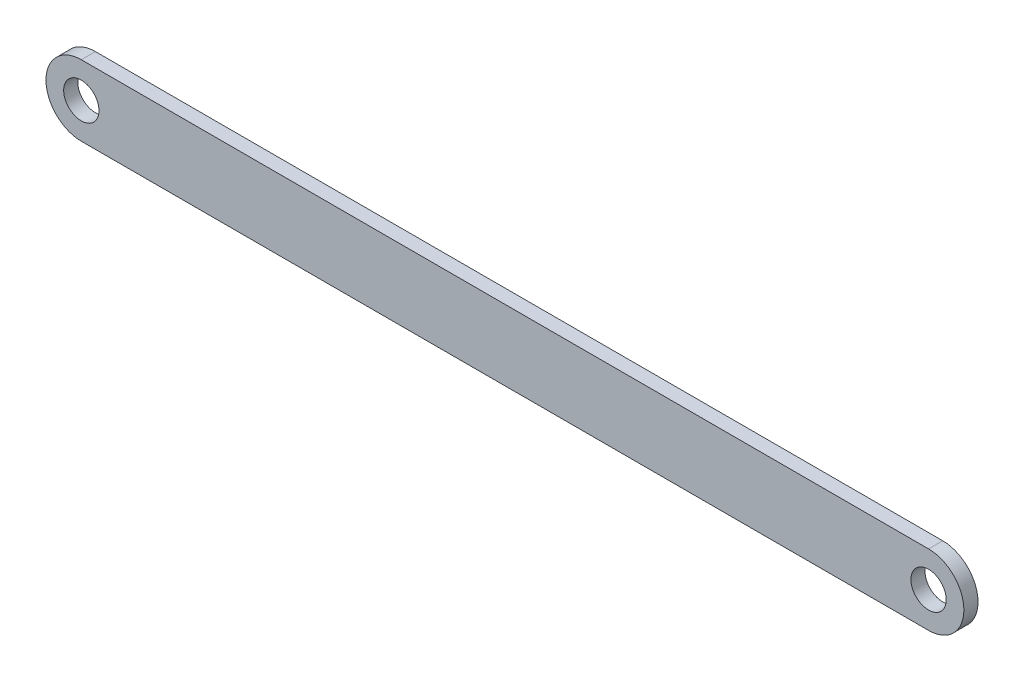
ISO-10303-21;
HEADER;
FILE_DESCRIPTION(('STEP AP214'),'2;1');
FILE_NAME('part.step','',(''),(''),'','','');
FILE_SCHEMA(('AUTOMOTIVE_DESIGN { 1 0 10303 214 1 1 1 1 }'));
ENDSEC;
DATA;
#1=APPLICATION_CONTEXT('core data for automotive mechanical design processes');
#2=APPLICATION_PROTOCOL_DEFINITION('international standard','automotive_design',2000,#1);
#3=PRODUCT_CONTEXT('',#1,'mechanical');
#4=PRODUCT('Part','Part','',(#3));
#5=PRODUCT_RELATED_PRODUCT_CATEGORY('part','',(#4));
#6=PRODUCT_DEFINITION_FORMATION('','',#4);
#7=PRODUCT_DEFINITION_CONTEXT('part definition',#1,'design');
#8=PRODUCT_DEFINITION('design','',#6,#7);
#9=PRODUCT_DEFINITION_SHAPE('','',#8);
#10=(LENGTH_UNIT() NAMED_UNIT(*) SI_UNIT(.MILLI.,.METRE.));
#11=(NAMED_UNIT(*) PLANE_ANGLE_UNIT() SI_UNIT($,.RADIAN.));
#12=(NAMED_UNIT(*) SI_UNIT($,.STERADIAN.) SOLID_ANGLE_UNIT());
#13=UNCERTAINTY_MEASURE_WITH_UNIT(LENGTH_MEASURE(1.E-05),#10,'distance_accuracy_value','');
#14=(GEOMETRIC_REPRESENTATION_CONTEXT(3) GLOBAL_UNCERTAINTY_ASSIGNED_CONTEXT((#13)) GLOBAL_UNIT_ASSIGNED_CONTEXT((#10,
#11,#12)) REPRESENTATION_CONTEXT('',''));
#15=CARTESIAN_POINT('',(0.,0.,0.));
#16=DIRECTION('',(0.,0.,1.));
#17=DIRECTION('',(1.,0.,0.));
#18=AXIS2_PLACEMENT_3D('',#15,#16,#17);
#19=CARTESIAN_POINT('',(76.2,0.,2.54));
#20=DIRECTION('',(0.,0.,-1.));
#21=DIRECTION('',(-1.,0.,0.));
#22=AXIS2_PLACEMENT_3D('',#19,#20,#21);
#23=PLANE('',#22);
#24=CARTESIAN_POINT('',(76.2,0.,2.54));
#25=DIRECTION('',(0.,0.,1.));
#26=DIRECTION('',(-1.,0.,0.));
#27=AXIS2_PLACEMENT_3D('',#24,#25,#26);
#28=CIRCLE('',#27,6.35);
#29=CARTESIAN_POINT('',(76.2,-6.35,2.54));
#30=VERTEX_POINT('',#29);
#31=CARTESIAN_POINT('',(76.2,6.35,2.54));
#32=VERTEX_POINT('',#31);
#33=EDGE_CURVE('E96',#30,#32,#28,.T.);
#34=ORIENTED_EDGE('',*,*,#33,.T.);
#35=DIRECTION('',(-1.,0.,0.));
#36=VECTOR('',#35,1.);
#37=CARTESIAN_POINT('',(-76.2,6.35,2.54));
#38=LINE('',#37,#36);
#39=CARTESIAN_POINT('',(-76.2,6.35,2.54));
#40=VERTEX_POINT('',#39);
#41=EDGE_CURVE('E91',#32,#40,#38,.T.);
#42=ORIENTED_EDGE('',*,*,#41,.T.);
#43=CARTESIAN_POINT('',(-76.2,0.,2.54));
#44=DIRECTION('',(0.,0.,1.));
#45=DIRECTION('',(1.,0.,0.));
#46=AXIS2_PLACEMENT_3D('',#43,#44,#45);
#47=CIRCLE('',#46,6.35);
#48=CARTESIAN_POINT('',(-76.2,-6.35,2.54));
#49=VERTEX_POINT('',#48);
#50=EDGE_CURVE('E94',#40,#49,#47,.T.);
#51=ORIENTED_EDGE('',*,*,#50,.T.);
#52=DIRECTION('',(1.,0.,0.));
#53=VECTOR('',#52,1.);
#54=CARTESIAN_POINT('',(-76.2,-6.35,2.54));
#55=LINE('',#54,#53);
#56=EDGE_CURVE('E61',#49,#30,#55,.T.);
#57=ORIENTED_EDGE('',*,*,#56,.T.);
#58=EDGE_LOOP('',(#34,#42,#51,#57));
#59=FACE_BOUND('',#58,.T.);
#60=CARTESIAN_POINT('',(-76.2,0.,2.54));
#61=DIRECTION('',(0.,0.,1.));
#62=DIRECTION('',(1.,0.,0.));
#63=AXIS2_PLACEMENT_3D('',#60,#61,#62);
#64=CIRCLE('',#63,3.175);
#65=CARTESIAN_POINT('',(-73.025,0.,2.54));
#66=VERTEX_POINT('',#65);
#67=EDGE_CURVE('E116',#66,#66,#64,.T.);
#68=ORIENTED_EDGE('',*,*,#67,.F.);
#69=EDGE_LOOP('',(#68));
#70=FACE_BOUND('',#69,.T.);
#71=CARTESIAN_POINT('',(76.2,0.,2.54));
#72=DIRECTION('',(0.,0.,1.));
#73=DIRECTION('',(-1.,0.,0.));
#74=AXIS2_PLACEMENT_3D('',#71,#72,#73);
#75=CIRCLE('',#74,3.175);
#76=CARTESIAN_POINT('',(73.025,0.,2.54));
#77=VERTEX_POINT('',#76);
#78=EDGE_CURVE('E138',#77,#77,#75,.T.);
#79=ORIENTED_EDGE('',*,*,#78,.F.);
#80=EDGE_LOOP('',(#79));
#81=FACE_BOUND('',#80,.T.);
#82=ADVANCED_FACE('F43',(#59,#70,#81),#23,.F.);
#83=CARTESIAN_POINT('',(76.2,0.,0.));
#84=DIRECTION('',(0.,0.,-1.));
#85=DIRECTION('',(-1.,0.,0.));
#86=AXIS2_PLACEMENT_3D('',#83,#84,#85);
#87=PLANE('',#86);
#88=CARTESIAN_POINT('',(-76.2,0.,0.));
#89=DIRECTION('',(0.,0.,1.));
#90=DIRECTION('',(1.,0.,0.));
#91=AXIS2_PLACEMENT_3D('',#88,#89,#90);
#92=CIRCLE('',#91,3.175);
#93=CARTESIAN_POINT('',(-73.025,0.,0.));
#94=VERTEX_POINT('',#93);
#95=EDGE_CURVE('E134',#94,#94,#92,.T.);
#96=ORIENTED_EDGE('',*,*,#95,.T.);
#97=EDGE_LOOP('',(#96));
#98=FACE_BOUND('',#97,.T.);
#99=CARTESIAN_POINT('',(76.2,0.,0.));
#100=DIRECTION('',(0.,0.,1.));
#101=DIRECTION('',(-1.,0.,0.));
#102=AXIS2_PLACEMENT_3D('',#99,#100,#101);
#103=CIRCLE('',#102,6.35);
#104=CARTESIAN_POINT('',(76.2,-6.35,0.));
#105=VERTEX_POINT('',#104);
#106=CARTESIAN_POINT('',(76.2,6.35,0.));
#107=VERTEX_POINT('',#106);
#108=EDGE_CURVE('E112',#105,#107,#103,.T.);
#109=ORIENTED_EDGE('',*,*,#108,.F.);
#110=DIRECTION('',(1.,0.,0.));
#111=VECTOR('',#110,1.);
#112=CARTESIAN_POINT('',(-76.2,-6.35,0.));
#113=LINE('',#112,#111);
#114=CARTESIAN_POINT('',(-76.2,-6.35,0.));
#115=VERTEX_POINT('',#114);
#116=EDGE_CURVE('E84',#115,#105,#113,.T.);
#117=ORIENTED_EDGE('',*,*,#116,.F.);
#118=CARTESIAN_POINT('',(-76.2,0.,0.));
#119=DIRECTION('',(0.,0.,1.));
#120=DIRECTION('',(1.,0.,0.));
#121=AXIS2_PLACEMENT_3D('',#118,#119,#120);
#122=CIRCLE('',#121,6.35);
#123=CARTESIAN_POINT('',(-76.2,6.35,0.));
#124=VERTEX_POINT('',#123);
#125=EDGE_CURVE('E78',#124,#115,#122,.T.);
#126=ORIENTED_EDGE('',*,*,#125,.F.);
#127=DIRECTION('',(-1.,0.,0.));
#128=VECTOR('',#127,1.);
#129=CARTESIAN_POINT('',(-76.2,6.35,0.));
#130=LINE('',#129,#128);
#131=EDGE_CURVE('E101',#107,#124,#130,.T.);
#132=ORIENTED_EDGE('',*,*,#131,.F.);
#133=EDGE_LOOP('',(#109,#117,#126,#132));
#134=FACE_BOUND('',#133,.T.);
#135=CARTESIAN_POINT('',(76.2,0.,0.));
#136=DIRECTION('',(0.,0.,1.));
#137=DIRECTION('',(-1.,0.,0.));
#138=AXIS2_PLACEMENT_3D('',#135,#136,#137);
#139=CIRCLE('',#138,3.175);
#140=CARTESIAN_POINT('',(73.025,0.,0.));
#141=VERTEX_POINT('',#140);
#142=EDGE_CURVE('E142',#141,#141,#139,.T.);
#143=ORIENTED_EDGE('',*,*,#142,.T.);
#144=EDGE_LOOP('',(#143));
#145=FACE_BOUND('',#144,.T.);
#146=ADVANCED_FACE('F129',(#98,#134,#145),#87,.T.);
#147=CARTESIAN_POINT('',(76.2,0.,2.54));
#148=DIRECTION('',(0.,0.,-1.));
#149=DIRECTION('',(-1.,0.,0.));
#150=AXIS2_PLACEMENT_3D('',#147,#148,#149);
#151=CYLINDRICAL_SURFACE('',#150,6.35);
#152=ORIENTED_EDGE('',*,*,#108,.T.);
#153=DIRECTION('',(0.,0.,-1.));
#154=VECTOR('',#153,1.);
#155=CARTESIAN_POINT('',(76.2,6.35,2.54));
#156=LINE('',#155,#154);
#157=EDGE_CURVE('E11',#32,#107,#156,.T.);
#158=ORIENTED_EDGE('',*,*,#157,.F.);
#159=ORIENTED_EDGE('',*,*,#33,.F.);
#160=DIRECTION('',(0.,0.,-1.));
#161=VECTOR('',#160,1.);
#162=CARTESIAN_POINT('',(76.2,-6.35,2.54));
#163=LINE('',#162,#161);
#164=EDGE_CURVE('E108',#30,#105,#163,.T.);
#165=ORIENTED_EDGE('',*,*,#164,.T.);
#166=EDGE_LOOP('',(#152,#158,#159,#165));
#167=FACE_BOUND('',#166,.T.);
#168=ADVANCED_FACE('F45',(#167),#151,.T.);
#169=CARTESIAN_POINT('',(-76.2,6.35,2.54));
#170=DIRECTION('',(0.,-1.,0.));
#171=DIRECTION('',(0.,0.,-1.));
#172=AXIS2_PLACEMENT_3D('',#169,#170,#171);
#173=PLANE('',#172);
#174=ORIENTED_EDGE('',*,*,#131,.T.);
#175=DIRECTION('',(0.,0.,-1.));
#176=VECTOR('',#175,1.);
#177=CARTESIAN_POINT('',(-76.2,6.35,2.54));
#178=LINE('',#177,#176);
#179=EDGE_CURVE('E53',#40,#124,#178,.T.);
#180=ORIENTED_EDGE('',*,*,#179,.F.);
#181=ORIENTED_EDGE('',*,*,#41,.F.);
#182=ORIENTED_EDGE('',*,*,#157,.T.);
#183=EDGE_LOOP('',(#174,#180,#181,#182));
#184=FACE_BOUND('',#183,.T.);
#185=ADVANCED_FACE('F100',(#184),#173,.F.);
#186=CARTESIAN_POINT('',(-76.2,0.,2.54));
#187=DIRECTION('',(0.,0.,-1.));
#188=DIRECTION('',(-1.,0.,0.));
#189=AXIS2_PLACEMENT_3D('',#186,#187,#188);
#190=CYLINDRICAL_SURFACE('',#189,6.35);
#191=ORIENTED_EDGE('',*,*,#125,.T.);
#192=DIRECTION('',(0.,0.,-1.));
#193=VECTOR('',#192,1.);
#194=CARTESIAN_POINT('',(-76.2,-6.35,2.54));
#195=LINE('',#194,#193);
#196=EDGE_CURVE('E103',#49,#115,#195,.T.);
#197=ORIENTED_EDGE('',*,*,#196,.F.);
#198=ORIENTED_EDGE('',*,*,#50,.F.);
#199=ORIENTED_EDGE('',*,*,#179,.T.);
#200=EDGE_LOOP('',(#191,#197,#198,#199));
#201=FACE_BOUND('',#200,.T.);
#202=ADVANCED_FACE('F104',(#201),#190,.T.);
#203=CARTESIAN_POINT('',(-76.2,-6.35,2.54));
#204=DIRECTION('',(0.,1.,0.));
#205=DIRECTION('',(0.,0.,1.));
#206=AXIS2_PLACEMENT_3D('',#203,#204,#205);
#207=PLANE('',#206);
#208=ORIENTED_EDGE('',*,*,#116,.T.);
#209=ORIENTED_EDGE('',*,*,#164,.F.);
#210=ORIENTED_EDGE('',*,*,#56,.F.);
#211=ORIENTED_EDGE('',*,*,#196,.T.);
#212=EDGE_LOOP('',(#208,#209,#210,#211));
#213=FACE_BOUND('',#212,.T.);
#214=ADVANCED_FACE('F126',(#213),#207,.F.);
#215=CARTESIAN_POINT('',(-76.2,0.,2.54));
#216=DIRECTION('',(0.,0.,-1.));
#217=DIRECTION('',(-1.,0.,0.));
#218=AXIS2_PLACEMENT_3D('',#215,#216,#217);
#219=CYLINDRICAL_SURFACE('',#218,3.175);
#220=ORIENTED_EDGE('',*,*,#67,.T.);
#221=EDGE_LOOP('',(#220));
#222=FACE_BOUND('',#221,.T.);
#223=ORIENTED_EDGE('',*,*,#95,.F.);
#224=EDGE_LOOP('',(#223));
#225=FACE_BOUND('',#224,.T.);
#226=ADVANCED_FACE('F161',(#222,#225),#219,.F.);
#227=CARTESIAN_POINT('',(76.2,0.,2.54));
#228=DIRECTION('',(0.,0.,-1.));
#229=DIRECTION('',(-1.,0.,0.));
#230=AXIS2_PLACEMENT_3D('',#227,#228,#229);
#231=CYLINDRICAL_SURFACE('',#230,3.175);
#232=ORIENTED_EDGE('',*,*,#78,.T.);
#233=EDGE_LOOP('',(#232));
#234=FACE_BOUND('',#233,.T.);
#235=ORIENTED_EDGE('',*,*,#142,.F.);
#236=EDGE_LOOP('',(#235));
#237=FACE_BOUND('',#236,.T.);
#238=ADVANCED_FACE('F150',(#234,#237),#231,.F.);
#239=CLOSED_SHELL('',(#82,#146,#168,#185,#202,#214,#226,#238));
#240=MANIFOLD_SOLID_BREP('B2',#239);
#241=ADVANCED_BREP_SHAPE_REPRESENTATION('',(#18,#240),#14);
#242=SHAPE_DEFINITION_REPRESENTATION(#9,#241);
ENDSEC;
END-ISO-10303-21;
